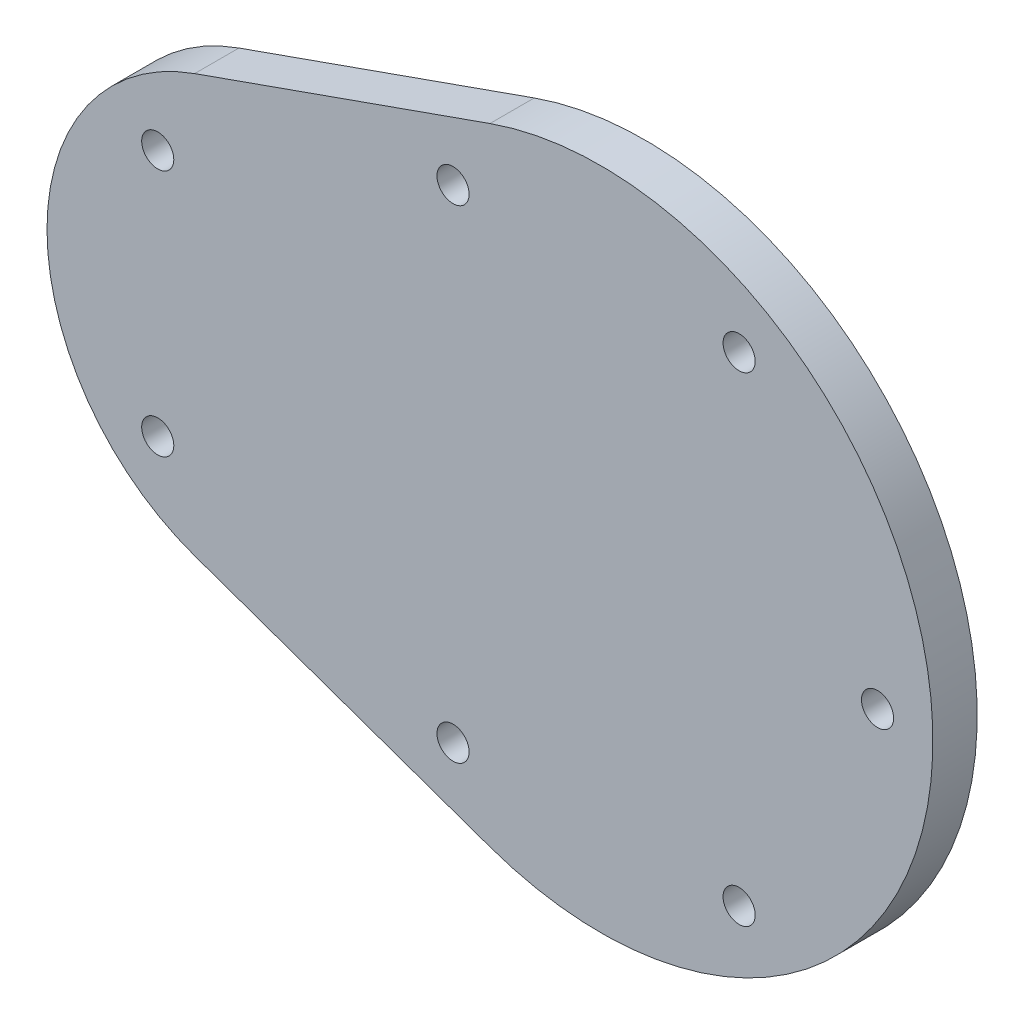
ISO-10303-21;
HEADER;
FILE_DESCRIPTION(('STEP AP214'),'2;1');
FILE_NAME('part.step','',(''),(''),'','','');
FILE_SCHEMA(('AUTOMOTIVE_DESIGN { 1 0 10303 214 1 1 1 1 }'));
ENDSEC;
DATA;
#1=APPLICATION_CONTEXT('core data for automotive mechanical design processes');
#2=APPLICATION_PROTOCOL_DEFINITION('international standard','automotive_design',2000,#1);
#3=PRODUCT_CONTEXT('',#1,'mechanical');
#4=PRODUCT('Part','Part','',(#3));
#5=PRODUCT_RELATED_PRODUCT_CATEGORY('part','',(#4));
#6=PRODUCT_DEFINITION_FORMATION('','',#4);
#7=PRODUCT_DEFINITION_CONTEXT('part definition',#1,'design');
#8=PRODUCT_DEFINITION('design','',#6,#7);
#9=PRODUCT_DEFINITION_SHAPE('','',#8);
#10=(LENGTH_UNIT() NAMED_UNIT(*) SI_UNIT(.MILLI.,.METRE.));
#11=(NAMED_UNIT(*) PLANE_ANGLE_UNIT() SI_UNIT($,.RADIAN.));
#12=(NAMED_UNIT(*) SI_UNIT($,.STERADIAN.) SOLID_ANGLE_UNIT());
#13=UNCERTAINTY_MEASURE_WITH_UNIT(LENGTH_MEASURE(1.E-05),#10,'distance_accuracy_value','');
#14=(GEOMETRIC_REPRESENTATION_CONTEXT(3) GLOBAL_UNCERTAINTY_ASSIGNED_CONTEXT((#13)) GLOBAL_UNIT_ASSIGNED_CONTEXT((#10,
#11,#12)) REPRESENTATION_CONTEXT('',''));
#15=CARTESIAN_POINT('',(0.,0.,0.));
#16=DIRECTION('',(0.,0.,1.));
#17=DIRECTION('',(1.,0.,0.));
#18=AXIS2_PLACEMENT_3D('',#15,#16,#17);
#19=CARTESIAN_POINT('',(-20.,56.5685424949238,8.));
#20=DIRECTION('',(0.333333333333333,-0.942809041582063,0.));
#21=DIRECTION('',(0.942809041582064,0.333333333333333,0.));
#22=AXIS2_PLACEMENT_3D('',#19,#20,#21);
#23=PLANE('',#22);
#24=DIRECTION('',(-0.942809041582063,-0.333333333333333,0.));
#25=VECTOR('',#24,1.);
#26=CARTESIAN_POINT('',(-20.,56.5685424949238,0.));
#27=LINE('',#26,#25);
#28=CARTESIAN_POINT('',(-20.,56.5685424949238,0.));
#29=VERTEX_POINT('',#28);
#30=CARTESIAN_POINT('',(-73.3333333333333,37.7123616632826,0.));
#31=VERTEX_POINT('',#30);
#32=EDGE_CURVE('E109',#29,#31,#27,.T.);
#33=ORIENTED_EDGE('',*,*,#32,.T.);
#34=DIRECTION('',(0.,0.,-1.));
#35=VECTOR('',#34,1.);
#36=CARTESIAN_POINT('',(-73.3333333333333,37.7123616632826,8.));
#37=LINE('',#36,#35);
#38=CARTESIAN_POINT('',(-73.3333333333333,37.7123616632826,8.));
#39=VERTEX_POINT('',#38);
#40=EDGE_CURVE('E47',#39,#31,#37,.T.);
#41=ORIENTED_EDGE('',*,*,#40,.F.);
#42=DIRECTION('',(-0.942809041582063,-0.333333333333333,0.));
#43=VECTOR('',#42,1.);
#44=CARTESIAN_POINT('',(-20.,56.5685424949238,8.));
#45=LINE('',#44,#43);
#46=CARTESIAN_POINT('',(-20.,56.5685424949238,8.));
#47=VERTEX_POINT('',#46);
#48=EDGE_CURVE('E99',#47,#39,#45,.T.);
#49=ORIENTED_EDGE('',*,*,#48,.F.);
#50=DIRECTION('',(0.,0.,-1.));
#51=VECTOR('',#50,1.);
#52=CARTESIAN_POINT('',(-20.,56.5685424949238,8.));
#53=LINE('',#52,#51);
#54=EDGE_CURVE('E11',#47,#29,#53,.T.);
#55=ORIENTED_EDGE('',*,*,#54,.T.);
#56=EDGE_LOOP('',(#33,#41,#49,#55));
#57=FACE_BOUND('',#56,.T.);
#58=ADVANCED_FACE('F37',(#57),#23,.F.);
#59=CARTESIAN_POINT('',(-60.,0.,8.));
#60=DIRECTION('',(0.,0.,-1.));
#61=DIRECTION('',(-1.,0.,0.));
#62=AXIS2_PLACEMENT_3D('',#59,#60,#61);
#63=CYLINDRICAL_SURFACE('',#62,40.);
#64=CARTESIAN_POINT('',(-60.,0.,0.));
#65=DIRECTION('',(0.,0.,-1.));
#66=DIRECTION('',(-1.,0.,0.));
#67=AXIS2_PLACEMENT_3D('',#64,#65,#66);
#68=CIRCLE('',#67,40.);
#69=CARTESIAN_POINT('',(-73.3333333333333,-37.7123616632825,0.));
#70=VERTEX_POINT('',#69);
#71=EDGE_CURVE('E88',#70,#31,#68,.T.);
#72=ORIENTED_EDGE('',*,*,#71,.F.);
#73=DIRECTION('',(0.,0.,-1.));
#74=VECTOR('',#73,1.);
#75=CARTESIAN_POINT('',(-73.3333333333333,-37.7123616632825,8.));
#76=LINE('',#75,#74);
#77=CARTESIAN_POINT('',(-73.3333333333333,-37.7123616632825,8.));
#78=VERTEX_POINT('',#77);
#79=EDGE_CURVE('E82',#78,#70,#76,.T.);
#80=ORIENTED_EDGE('',*,*,#79,.F.);
#81=CARTESIAN_POINT('',(-60.,0.,8.));
#82=DIRECTION('',(0.,0.,-1.));
#83=DIRECTION('',(-1.,0.,0.));
#84=AXIS2_PLACEMENT_3D('',#81,#82,#83);
#85=CIRCLE('',#84,40.);
#86=EDGE_CURVE('E86',#78,#39,#85,.T.);
#87=ORIENTED_EDGE('',*,*,#86,.T.);
#88=ORIENTED_EDGE('',*,*,#40,.T.);
#89=EDGE_LOOP('',(#72,#80,#87,#88));
#90=FACE_BOUND('',#89,.T.);
#91=ADVANCED_FACE('F84',(#90),#63,.T.);
#92=CARTESIAN_POINT('',(-73.3333333333333,-37.7123616632825,8.));
#93=DIRECTION('',(0.333333333333333,0.942809041582063,0.));
#94=DIRECTION('',(-0.942809041582064,0.333333333333333,0.));
#95=AXIS2_PLACEMENT_3D('',#92,#93,#94);
#96=PLANE('',#95);
#97=DIRECTION('',(0.942809041582063,-0.333333333333333,0.));
#98=VECTOR('',#97,1.);
#99=CARTESIAN_POINT('',(-73.3333333333333,-37.7123616632825,0.));
#100=LINE('',#99,#98);
#101=CARTESIAN_POINT('',(-20.,-56.5685424949238,0.));
#102=VERTEX_POINT('',#101);
#103=EDGE_CURVE('E105',#70,#102,#100,.T.);
#104=ORIENTED_EDGE('',*,*,#103,.T.);
#105=DIRECTION('',(0.,0.,-1.));
#106=VECTOR('',#105,1.);
#107=CARTESIAN_POINT('',(-20.,-56.5685424949238,8.));
#108=LINE('',#107,#106);
#109=CARTESIAN_POINT('',(-20.,-56.5685424949238,8.));
#110=VERTEX_POINT('',#109);
#111=EDGE_CURVE('E91',#110,#102,#108,.T.);
#112=ORIENTED_EDGE('',*,*,#111,.F.);
#113=DIRECTION('',(0.942809041582063,-0.333333333333333,0.));
#114=VECTOR('',#113,1.);
#115=CARTESIAN_POINT('',(-73.3333333333333,-37.7123616632825,8.));
#116=LINE('',#115,#114);
#117=EDGE_CURVE('E94',#78,#110,#116,.T.);
#118=ORIENTED_EDGE('',*,*,#117,.F.);
#119=ORIENTED_EDGE('',*,*,#79,.T.);
#120=EDGE_LOOP('',(#104,#112,#118,#119));
#121=FACE_BOUND('',#120,.T.);
#122=ADVANCED_FACE('F95',(#121),#96,.F.);
#123=CARTESIAN_POINT('',(0.,0.,8.));
#124=DIRECTION('',(0.,0.,-1.));
#125=DIRECTION('',(-1.,0.,0.));
#126=AXIS2_PLACEMENT_3D('',#123,#124,#125);
#127=CYLINDRICAL_SURFACE('',#126,60.);
#128=CARTESIAN_POINT('',(0.,0.,0.));
#129=DIRECTION('',(0.,0.,1.));
#130=DIRECTION('',(1.,0.,0.));
#131=AXIS2_PLACEMENT_3D('',#128,#129,#130);
#132=CIRCLE('',#131,60.);
#133=EDGE_CURVE('E76',#102,#29,#132,.T.);
#134=ORIENTED_EDGE('',*,*,#133,.T.);
#135=ORIENTED_EDGE('',*,*,#54,.F.);
#136=CARTESIAN_POINT('',(0.,0.,8.));
#137=DIRECTION('',(0.,0.,-1.));
#138=DIRECTION('',(-1.,0.,0.));
#139=AXIS2_PLACEMENT_3D('',#136,#137,#138);
#140=CIRCLE('',#139,60.);
#141=EDGE_CURVE('E79',#47,#110,#140,.T.);
#142=ORIENTED_EDGE('',*,*,#141,.T.);
#143=ORIENTED_EDGE('',*,*,#111,.T.);
#144=EDGE_LOOP('',(#134,#135,#142,#143));
#145=FACE_BOUND('',#144,.T.);
#146=ADVANCED_FACE('F39',(#145),#127,.T.);
#147=CARTESIAN_POINT('',(0.,0.,8.));
#148=DIRECTION('',(0.,0.,-1.));
#149=DIRECTION('',(-1.,0.,0.));
#150=AXIS2_PLACEMENT_3D('',#147,#148,#149);
#151=PLANE('',#150);
#152=CARTESIAN_POINT('',(50.0000000000003,-1.83549636069734E-12,8.));
#153=DIRECTION('',(0.,0.,1.));
#154=DIRECTION('',(1.,0.,0.));
#155=AXIS2_PLACEMENT_3D('',#152,#153,#154);
#156=CIRCLE('',#155,2.89999999999999);
#157=CARTESIAN_POINT('',(52.9000000000003,-1.83549636069734E-12,8.));
#158=VERTEX_POINT('',#157);
#159=EDGE_CURVE('E140',#158,#158,#156,.T.);
#160=ORIENTED_EDGE('',*,*,#159,.F.);
#161=EDGE_LOOP('',(#160));
#162=FACE_BOUND('',#161,.T.);
#163=CARTESIAN_POINT('',(24.9999999999992,-43.3012701892219,8.));
#164=DIRECTION('',(0.,0.,1.));
#165=DIRECTION('',(1.,0.,0.));
#166=AXIS2_PLACEMENT_3D('',#163,#164,#165);
#167=CIRCLE('',#166,2.89999999999999);
#168=CARTESIAN_POINT('',(27.8999999999992,-43.3012701892219,8.));
#169=VERTEX_POINT('',#168);
#170=EDGE_CURVE('E130',#169,#169,#167,.T.);
#171=ORIENTED_EDGE('',*,*,#170,.F.);
#172=EDGE_LOOP('',(#171));
#173=FACE_BOUND('',#172,.T.);
#174=CARTESIAN_POINT('',(24.9999999999992,43.3012701892183,8.));
#175=DIRECTION('',(0.,0.,1.));
#176=DIRECTION('',(1.,0.,0.));
#177=AXIS2_PLACEMENT_3D('',#174,#175,#176);
#178=CIRCLE('',#177,2.89999999999999);
#179=CARTESIAN_POINT('',(27.8999999999992,43.3012701892183,8.));
#180=VERTEX_POINT('',#179);
#181=EDGE_CURVE('E127',#180,#180,#178,.T.);
#182=ORIENTED_EDGE('',*,*,#181,.F.);
#183=EDGE_LOOP('',(#182));
#184=FACE_BOUND('',#183,.T.);
#185=CARTESIAN_POINT('',(-80.0000000000008,-22.3606797749979,8.));
#186=DIRECTION('',(0.,0.,1.));
#187=DIRECTION('',(1.,0.,0.));
#188=AXIS2_PLACEMENT_3D('',#185,#186,#187);
#189=CIRCLE('',#188,2.89999999999999);
#190=CARTESIAN_POINT('',(-77.1000000000008,-22.3606797749979,8.));
#191=VERTEX_POINT('',#190);
#192=EDGE_CURVE('E124',#191,#191,#189,.T.);
#193=ORIENTED_EDGE('',*,*,#192,.F.);
#194=EDGE_LOOP('',(#193));
#195=FACE_BOUND('',#194,.T.);
#196=CARTESIAN_POINT('',(-80.0000000000008,22.3606797749942,8.));
#197=DIRECTION('',(0.,0.,1.));
#198=DIRECTION('',(1.,0.,0.));
#199=AXIS2_PLACEMENT_3D('',#196,#197,#198);
#200=CIRCLE('',#199,2.89999999999999);
#201=CARTESIAN_POINT('',(-77.1000000000008,22.3606797749942,8.));
#202=VERTEX_POINT('',#201);
#203=EDGE_CURVE('E123',#202,#202,#200,.T.);
#204=ORIENTED_EDGE('',*,*,#203,.F.);
#205=EDGE_LOOP('',(#204));
#206=FACE_BOUND('',#205,.T.);
#207=CARTESIAN_POINT('',(-26.6666666666674,-43.6049181731704,8.));
#208=DIRECTION('',(0.,0.,1.));
#209=DIRECTION('',(1.,0.,0.));
#210=AXIS2_PLACEMENT_3D('',#207,#208,#209);
#211=CIRCLE('',#210,2.89999999999999);
#212=CARTESIAN_POINT('',(-23.7666666666674,-43.6049181731704,8.));
#213=VERTEX_POINT('',#212);
#214=EDGE_CURVE('E119',#213,#213,#211,.T.);
#215=ORIENTED_EDGE('',*,*,#214,.F.);
#216=EDGE_LOOP('',(#215));
#217=FACE_BOUND('',#216,.T.);
#218=CARTESIAN_POINT('',(-26.6666666666674,43.6049181731704,8.));
#219=DIRECTION('',(0.,0.,1.));
#220=DIRECTION('',(1.,0.,0.));
#221=AXIS2_PLACEMENT_3D('',#218,#219,#220);
#222=CIRCLE('',#221,2.89999999999999);
#223=CARTESIAN_POINT('',(-23.7666666666674,43.6049181731704,8.));
#224=VERTEX_POINT('',#223);
#225=EDGE_CURVE('E115',#224,#224,#222,.T.);
#226=ORIENTED_EDGE('',*,*,#225,.F.);
#227=EDGE_LOOP('',(#226));
#228=FACE_BOUND('',#227,.T.);
#229=ORIENTED_EDGE('',*,*,#141,.F.);
#230=ORIENTED_EDGE('',*,*,#48,.T.);
#231=ORIENTED_EDGE('',*,*,#86,.F.);
#232=ORIENTED_EDGE('',*,*,#117,.T.);
#233=EDGE_LOOP('',(#229,#230,#231,#232));
#234=FACE_BOUND('',#233,.T.);
#235=ADVANCED_FACE('F98',(#162,#173,#184,#195,#206,#217,#228,#234),#151,.F.);
#236=CARTESIAN_POINT('',(0.,0.,0.));
#237=DIRECTION('',(0.,0.,-1.));
#238=DIRECTION('',(-1.,0.,0.));
#239=AXIS2_PLACEMENT_3D('',#236,#237,#238);
#240=PLANE('',#239);
#241=CARTESIAN_POINT('',(50.0000000000003,-1.83549636069734E-12,0.));
#242=DIRECTION('',(0.,0.,-1.));
#243=DIRECTION('',(-1.,0.,0.));
#244=AXIS2_PLACEMENT_3D('',#241,#242,#243);
#245=CIRCLE('',#244,2.89999999999993);
#246=CARTESIAN_POINT('',(47.1000000000004,-1.83549636069734E-12,0.));
#247=VERTEX_POINT('',#246);
#248=EDGE_CURVE('E41',#247,#247,#245,.T.);
#249=ORIENTED_EDGE('',*,*,#248,.F.);
#250=EDGE_LOOP('',(#249));
#251=FACE_BOUND('',#250,.T.);
#252=CARTESIAN_POINT('',(24.9999999999992,-43.3012701892219,0.));
#253=DIRECTION('',(0.,0.,-1.));
#254=DIRECTION('',(-1.,0.,0.));
#255=AXIS2_PLACEMENT_3D('',#252,#253,#254);
#256=CIRCLE('',#255,2.89999999999993);
#257=CARTESIAN_POINT('',(22.0999999999993,-43.3012701892219,0.));
#258=VERTEX_POINT('',#257);
#259=EDGE_CURVE('E128',#258,#258,#256,.T.);
#260=ORIENTED_EDGE('',*,*,#259,.F.);
#261=EDGE_LOOP('',(#260));
#262=FACE_BOUND('',#261,.T.);
#263=CARTESIAN_POINT('',(24.9999999999992,43.3012701892183,0.));
#264=DIRECTION('',(0.,0.,-1.));
#265=DIRECTION('',(-1.,0.,0.));
#266=AXIS2_PLACEMENT_3D('',#263,#264,#265);
#267=CIRCLE('',#266,2.89999999999993);
#268=CARTESIAN_POINT('',(22.0999999999993,43.3012701892183,0.));
#269=VERTEX_POINT('',#268);
#270=EDGE_CURVE('E125',#269,#269,#267,.T.);
#271=ORIENTED_EDGE('',*,*,#270,.F.);
#272=EDGE_LOOP('',(#271));
#273=FACE_BOUND('',#272,.T.);
#274=CARTESIAN_POINT('',(-80.0000000000008,-22.3606797749979,0.));
#275=DIRECTION('',(0.,0.,-1.));
#276=DIRECTION('',(-1.,0.,0.));
#277=AXIS2_PLACEMENT_3D('',#274,#275,#276);
#278=CIRCLE('',#277,2.89999999999993);
#279=CARTESIAN_POINT('',(-82.9000000000007,-22.3606797749979,0.));
#280=VERTEX_POINT('',#279);
#281=EDGE_CURVE('E120',#280,#280,#278,.T.);
#282=ORIENTED_EDGE('',*,*,#281,.F.);
#283=EDGE_LOOP('',(#282));
#284=FACE_BOUND('',#283,.T.);
#285=CARTESIAN_POINT('',(-80.0000000000008,22.3606797749942,0.));
#286=DIRECTION('',(0.,0.,-1.));
#287=DIRECTION('',(-1.,0.,0.));
#288=AXIS2_PLACEMENT_3D('',#285,#286,#287);
#289=CIRCLE('',#288,2.89999999999993);
#290=CARTESIAN_POINT('',(-82.9000000000007,22.3606797749942,0.));
#291=VERTEX_POINT('',#290);
#292=EDGE_CURVE('E147',#291,#291,#289,.T.);
#293=ORIENTED_EDGE('',*,*,#292,.F.);
#294=EDGE_LOOP('',(#293));
#295=FACE_BOUND('',#294,.T.);
#296=CARTESIAN_POINT('',(-26.6666666666674,-43.6049181731704,0.));
#297=DIRECTION('',(0.,0.,-1.));
#298=DIRECTION('',(-1.,0.,0.));
#299=AXIS2_PLACEMENT_3D('',#296,#297,#298);
#300=CIRCLE('',#299,2.89999999999993);
#301=CARTESIAN_POINT('',(-29.5666666666674,-43.6049181731704,0.));
#302=VERTEX_POINT('',#301);
#303=EDGE_CURVE('E116',#302,#302,#300,.T.);
#304=ORIENTED_EDGE('',*,*,#303,.F.);
#305=EDGE_LOOP('',(#304));
#306=FACE_BOUND('',#305,.T.);
#307=CARTESIAN_POINT('',(-26.6666666666674,43.6049181731704,0.));
#308=DIRECTION('',(0.,0.,-1.));
#309=DIRECTION('',(-1.,0.,0.));
#310=AXIS2_PLACEMENT_3D('',#307,#308,#309);
#311=CIRCLE('',#310,2.89999999999993);
#312=CARTESIAN_POINT('',(-29.5666666666674,43.6049181731704,0.));
#313=VERTEX_POINT('',#312);
#314=EDGE_CURVE('E106',#313,#313,#311,.T.);
#315=ORIENTED_EDGE('',*,*,#314,.F.);
#316=EDGE_LOOP('',(#315));
#317=FACE_BOUND('',#316,.T.);
#318=ORIENTED_EDGE('',*,*,#32,.F.);
#319=ORIENTED_EDGE('',*,*,#133,.F.);
#320=ORIENTED_EDGE('',*,*,#103,.F.);
#321=ORIENTED_EDGE('',*,*,#71,.T.);
#322=EDGE_LOOP('',(#318,#319,#320,#321));
#323=FACE_BOUND('',#322,.T.);
#324=ADVANCED_FACE('F158',(#251,#262,#273,#284,#295,#306,#317,#323),#240,.T.);
#325=CARTESIAN_POINT('',(-26.6666666666674,43.6049181731704,8.));
#326=DIRECTION('',(0.,0.,1.));
#327=DIRECTION('',(1.,0.,0.));
#328=AXIS2_PLACEMENT_3D('',#325,#326,#327);
#329=CYLINDRICAL_SURFACE('',#328,2.89999999999993);
#330=ORIENTED_EDGE('',*,*,#314,.T.);
#331=EDGE_LOOP('',(#330));
#332=FACE_BOUND('',#331,.T.);
#333=ORIENTED_EDGE('',*,*,#225,.T.);
#334=EDGE_LOOP('',(#333));
#335=FACE_BOUND('',#334,.T.);
#336=ADVANCED_FACE('F155',(#332,#335),#329,.F.);
#337=CARTESIAN_POINT('',(-26.6666666666674,-43.6049181731704,8.));
#338=DIRECTION('',(0.,0.,1.));
#339=DIRECTION('',(1.,0.,0.));
#340=AXIS2_PLACEMENT_3D('',#337,#338,#339);
#341=CYLINDRICAL_SURFACE('',#340,2.89999999999993);
#342=ORIENTED_EDGE('',*,*,#303,.T.);
#343=EDGE_LOOP('',(#342));
#344=FACE_BOUND('',#343,.T.);
#345=ORIENTED_EDGE('',*,*,#214,.T.);
#346=EDGE_LOOP('',(#345));
#347=FACE_BOUND('',#346,.T.);
#348=ADVANCED_FACE('F205',(#344,#347),#341,.F.);
#349=CARTESIAN_POINT('',(-80.0000000000008,22.3606797749942,8.));
#350=DIRECTION('',(0.,0.,1.));
#351=DIRECTION('',(1.,0.,0.));
#352=AXIS2_PLACEMENT_3D('',#349,#350,#351);
#353=CYLINDRICAL_SURFACE('',#352,2.89999999999993);
#354=ORIENTED_EDGE('',*,*,#292,.T.);
#355=EDGE_LOOP('',(#354));
#356=FACE_BOUND('',#355,.T.);
#357=ORIENTED_EDGE('',*,*,#203,.T.);
#358=EDGE_LOOP('',(#357));
#359=FACE_BOUND('',#358,.T.);
#360=ADVANCED_FACE('F211',(#356,#359),#353,.F.);
#361=CARTESIAN_POINT('',(-80.0000000000008,-22.3606797749979,8.));
#362=DIRECTION('',(0.,0.,1.));
#363=DIRECTION('',(1.,0.,0.));
#364=AXIS2_PLACEMENT_3D('',#361,#362,#363);
#365=CYLINDRICAL_SURFACE('',#364,2.89999999999993);
#366=ORIENTED_EDGE('',*,*,#281,.T.);
#367=EDGE_LOOP('',(#366));
#368=FACE_BOUND('',#367,.T.);
#369=ORIENTED_EDGE('',*,*,#192,.T.);
#370=EDGE_LOOP('',(#369));
#371=FACE_BOUND('',#370,.T.);
#372=ADVANCED_FACE('F219',(#368,#371),#365,.F.);
#373=CARTESIAN_POINT('',(24.9999999999992,43.3012701892183,8.));
#374=DIRECTION('',(0.,0.,1.));
#375=DIRECTION('',(1.,0.,0.));
#376=AXIS2_PLACEMENT_3D('',#373,#374,#375);
#377=CYLINDRICAL_SURFACE('',#376,2.89999999999993);
#378=ORIENTED_EDGE('',*,*,#270,.T.);
#379=EDGE_LOOP('',(#378));
#380=FACE_BOUND('',#379,.T.);
#381=ORIENTED_EDGE('',*,*,#181,.T.);
#382=EDGE_LOOP('',(#381));
#383=FACE_BOUND('',#382,.T.);
#384=ADVANCED_FACE('F227',(#380,#383),#377,.F.);
#385=CARTESIAN_POINT('',(24.9999999999992,-43.3012701892219,8.));
#386=DIRECTION('',(0.,0.,1.));
#387=DIRECTION('',(1.,0.,0.));
#388=AXIS2_PLACEMENT_3D('',#385,#386,#387);
#389=CYLINDRICAL_SURFACE('',#388,2.89999999999993);
#390=ORIENTED_EDGE('',*,*,#259,.T.);
#391=EDGE_LOOP('',(#390));
#392=FACE_BOUND('',#391,.T.);
#393=ORIENTED_EDGE('',*,*,#170,.T.);
#394=EDGE_LOOP('',(#393));
#395=FACE_BOUND('',#394,.T.);
#396=ADVANCED_FACE('F235',(#392,#395),#389,.F.);
#397=CARTESIAN_POINT('',(50.0000000000003,-1.83549636069734E-12,8.));
#398=DIRECTION('',(0.,0.,1.));
#399=DIRECTION('',(1.,0.,0.));
#400=AXIS2_PLACEMENT_3D('',#397,#398,#399);
#401=CYLINDRICAL_SURFACE('',#400,2.89999999999993);
#402=ORIENTED_EDGE('',*,*,#248,.T.);
#403=EDGE_LOOP('',(#402));
#404=FACE_BOUND('',#403,.T.);
#405=ORIENTED_EDGE('',*,*,#159,.T.);
#406=EDGE_LOOP('',(#405));
#407=FACE_BOUND('',#406,.T.);
#408=ADVANCED_FACE('F243',(#404,#407),#401,.F.);
#409=CLOSED_SHELL('',(#58,#91,#122,#146,#235,#324,#336,#348,#360,#372,#384,#396,#408));
#410=MANIFOLD_SOLID_BREP('B2',#409);
#411=ADVANCED_BREP_SHAPE_REPRESENTATION('',(#18,#410),#14);
#412=SHAPE_DEFINITION_REPRESENTATION(#9,#411);
ENDSEC;
END-ISO-10303-21;
